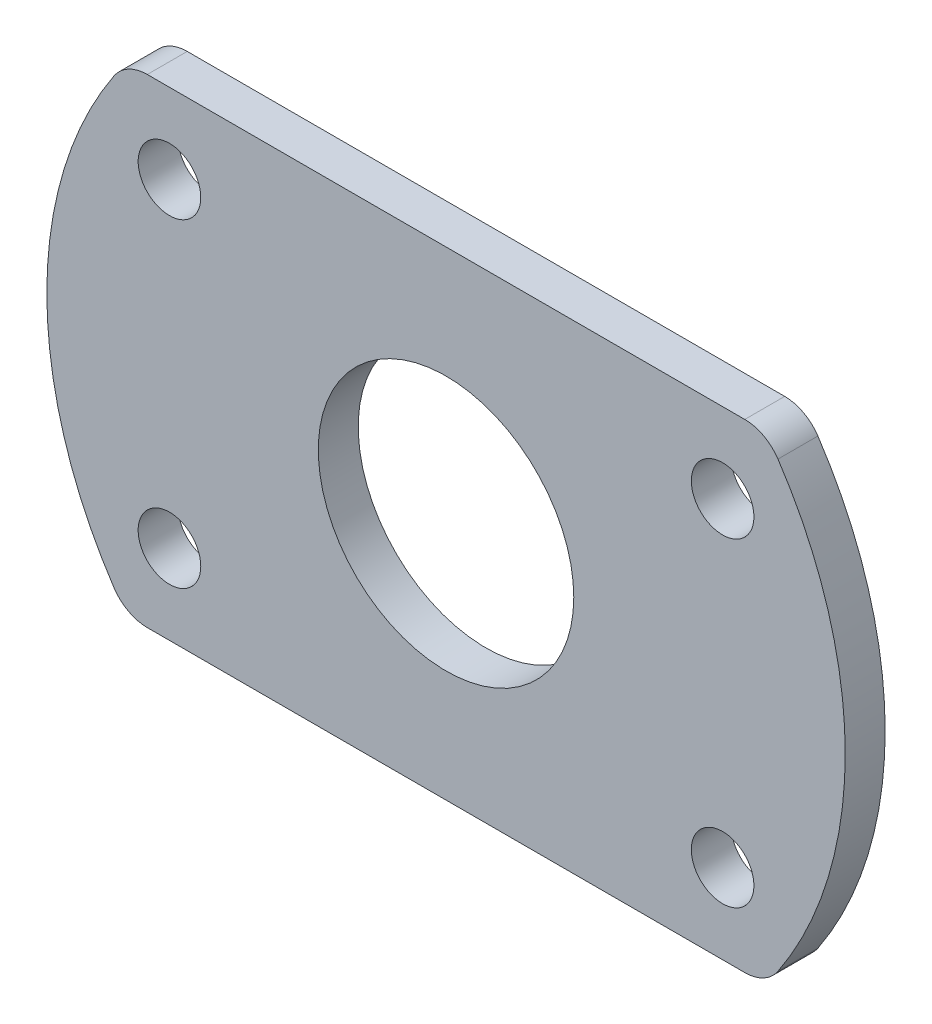
ISO-10303-21;
HEADER;
FILE_DESCRIPTION(('STEP AP214'),'2;1');
FILE_NAME('part.step','',(''),(''),'','','');
FILE_SCHEMA(('AUTOMOTIVE_DESIGN { 1 0 10303 214 1 1 1 1 }'));
ENDSEC;
DATA;
#1=APPLICATION_CONTEXT('core data for automotive mechanical design processes');
#2=APPLICATION_PROTOCOL_DEFINITION('international standard','automotive_design',2000,#1);
#3=PRODUCT_CONTEXT('',#1,'mechanical');
#4=PRODUCT('Part','Part','',(#3));
#5=PRODUCT_RELATED_PRODUCT_CATEGORY('part','',(#4));
#6=PRODUCT_DEFINITION_FORMATION('','',#4);
#7=PRODUCT_DEFINITION_CONTEXT('part definition',#1,'design');
#8=PRODUCT_DEFINITION('design','',#6,#7);
#9=PRODUCT_DEFINITION_SHAPE('','',#8);
#10=(LENGTH_UNIT() NAMED_UNIT(*) SI_UNIT(.MILLI.,.METRE.));
#11=(NAMED_UNIT(*) PLANE_ANGLE_UNIT() SI_UNIT($,.RADIAN.));
#12=(NAMED_UNIT(*) SI_UNIT($,.STERADIAN.) SOLID_ANGLE_UNIT());
#13=UNCERTAINTY_MEASURE_WITH_UNIT(LENGTH_MEASURE(1.E-05),#10,'distance_accuracy_value','');
#14=(GEOMETRIC_REPRESENTATION_CONTEXT(3) GLOBAL_UNCERTAINTY_ASSIGNED_CONTEXT((#13)) GLOBAL_UNIT_ASSIGNED_CONTEXT((#10,
#11,#12)) REPRESENTATION_CONTEXT('',''));
#15=CARTESIAN_POINT('',(0.,0.,0.));
#16=DIRECTION('',(0.,0.,1.));
#17=DIRECTION('',(1.,0.,0.));
#18=AXIS2_PLACEMENT_3D('',#15,#16,#17);
#19=CARTESIAN_POINT('',(0.,0.,1.5875));
#20=DIRECTION('',(0.,0.,1.));
#21=DIRECTION('',(1.,0.,0.));
#22=AXIS2_PLACEMENT_3D('',#19,#20,#21);
#23=PLANE('',#22);
#24=CARTESIAN_POINT('',(-21.9970452561248,12.7,1.5875));
#25=DIRECTION('',(0.,0.,1.));
#26=DIRECTION('',(1.,0.,0.));
#27=AXIS2_PLACEMENT_3D('',#24,#25,#26);
#28=CIRCLE('',#27,2.4892000000003);
#29=CARTESIAN_POINT('',(-19.5078452561245,12.7,1.5875));
#30=VERTEX_POINT('',#29);
#31=EDGE_CURVE('E200',#30,#30,#28,.T.);
#32=ORIENTED_EDGE('',*,*,#31,.F.);
#33=EDGE_LOOP('',(#32));
#34=FACE_BOUND('',#33,.T.);
#35=CARTESIAN_POINT('',(21.9970452561247,-12.7000000000001,1.5875));
#36=DIRECTION('',(0.,0.,1.));
#37=DIRECTION('',(1.,0.,0.));
#38=AXIS2_PLACEMENT_3D('',#35,#36,#37);
#39=CIRCLE('',#38,2.4892);
#40=CARTESIAN_POINT('',(24.4862452561247,-12.7000000000001,1.5875));
#41=VERTEX_POINT('',#40);
#42=EDGE_CURVE('E189',#41,#41,#39,.T.);
#43=ORIENTED_EDGE('',*,*,#42,.F.);
#44=EDGE_LOOP('',(#43));
#45=FACE_BOUND('',#44,.T.);
#46=DIRECTION('',(-1.,0.,0.));
#47=VECTOR('',#46,1.);
#48=CARTESIAN_POINT('',(0.,19.05,1.5875));
#49=LINE('',#48,#47);
#50=CARTESIAN_POINT('',(23.7595244060145,19.05,1.5875));
#51=VERTEX_POINT('',#50);
#52=CARTESIAN_POINT('',(-23.7595244060145,19.05,1.5875));
#53=VERTEX_POINT('',#52);
#54=EDGE_CURVE('E144',#51,#53,#49,.T.);
#55=ORIENTED_EDGE('',*,*,#54,.T.);
#56=CARTESIAN_POINT('',(-23.7595244060145,15.875,1.5875));
#57=DIRECTION('',(0.,0.,1.));
#58=DIRECTION('',(1.,0.,0.));
#59=AXIS2_PLACEMENT_3D('',#56,#57,#58);
#60=CIRCLE('',#59,3.175);
#61=CARTESIAN_POINT('',(-26.3994715622384,17.6388888888889,1.5875));
#62=VERTEX_POINT('',#61);
#63=EDGE_CURVE('E163',#53,#62,#60,.T.);
#64=ORIENTED_EDGE('',*,*,#63,.T.);
#65=CARTESIAN_POINT('',(0.,0.,1.5875));
#66=DIRECTION('',(0.,0.,1.));
#67=DIRECTION('',(1.,0.,0.));
#68=AXIS2_PLACEMENT_3D('',#65,#66,#67);
#69=CIRCLE('',#68,31.75);
#70=CARTESIAN_POINT('',(-26.3994715622384,-17.6388888888889,1.5875));
#71=VERTEX_POINT('',#70);
#72=EDGE_CURVE('E127',#62,#71,#69,.T.);
#73=ORIENTED_EDGE('',*,*,#72,.T.);
#74=CARTESIAN_POINT('',(-23.7595244060145,-15.875,1.5875));
#75=DIRECTION('',(0.,0.,1.));
#76=DIRECTION('',(1.,0.,0.));
#77=AXIS2_PLACEMENT_3D('',#74,#75,#76);
#78=CIRCLE('',#77,3.175);
#79=CARTESIAN_POINT('',(-23.7595244060145,-19.05,1.5875));
#80=VERTEX_POINT('',#79);
#81=EDGE_CURVE('E158',#71,#80,#78,.T.);
#82=ORIENTED_EDGE('',*,*,#81,.T.);
#83=DIRECTION('',(1.,0.,0.));
#84=VECTOR('',#83,1.);
#85=CARTESIAN_POINT('',(-25.4,-19.05,1.5875));
#86=LINE('',#85,#84);
#87=CARTESIAN_POINT('',(23.7595244060145,-19.05,1.5875));
#88=VERTEX_POINT('',#87);
#89=EDGE_CURVE('E174',#80,#88,#86,.T.);
#90=ORIENTED_EDGE('',*,*,#89,.T.);
#91=CARTESIAN_POINT('',(23.7595244060145,-15.875,1.5875));
#92=DIRECTION('',(0.,0.,1.));
#93=DIRECTION('',(1.,0.,0.));
#94=AXIS2_PLACEMENT_3D('',#91,#92,#93);
#95=CIRCLE('',#94,3.175);
#96=CARTESIAN_POINT('',(26.3994715622384,-17.6388888888889,1.5875));
#97=VERTEX_POINT('',#96);
#98=EDGE_CURVE('E63',#88,#97,#95,.T.);
#99=ORIENTED_EDGE('',*,*,#98,.T.);
#100=CARTESIAN_POINT('',(0.,0.,1.5875));
#101=DIRECTION('',(0.,0.,1.));
#102=DIRECTION('',(1.,0.,0.));
#103=AXIS2_PLACEMENT_3D('',#100,#101,#102);
#104=CIRCLE('',#103,31.75);
#105=CARTESIAN_POINT('',(26.3994715622384,17.6388888888889,1.5875));
#106=VERTEX_POINT('',#105);
#107=EDGE_CURVE('E182',#97,#106,#104,.T.);
#108=ORIENTED_EDGE('',*,*,#107,.T.);
#109=CARTESIAN_POINT('',(23.7595244060145,15.875,1.5875));
#110=DIRECTION('',(0.,0.,1.));
#111=DIRECTION('',(1.,0.,0.));
#112=AXIS2_PLACEMENT_3D('',#109,#110,#111);
#113=CIRCLE('',#112,3.175);
#114=EDGE_CURVE('E161',#106,#51,#113,.T.);
#115=ORIENTED_EDGE('',*,*,#114,.T.);
#116=EDGE_LOOP('',(#55,#64,#73,#82,#90,#99,#108,#115));
#117=FACE_BOUND('',#116,.T.);
#118=CARTESIAN_POINT('',(21.9970452561248,12.6999999999999,1.5875));
#119=DIRECTION('',(0.,0.,1.));
#120=DIRECTION('',(1.,0.,0.));
#121=AXIS2_PLACEMENT_3D('',#118,#119,#120);
#122=CIRCLE('',#121,2.4892);
#123=CARTESIAN_POINT('',(24.4862452561248,12.6999999999999,1.5875));
#124=VERTEX_POINT('',#123);
#125=EDGE_CURVE('E135',#124,#124,#122,.T.);
#126=ORIENTED_EDGE('',*,*,#125,.F.);
#127=EDGE_LOOP('',(#126));
#128=FACE_BOUND('',#127,.T.);
#129=CARTESIAN_POINT('',(-21.9970452561249,-12.6999999999998,1.5875));
#130=DIRECTION('',(0.,0.,1.));
#131=DIRECTION('',(1.,0.,0.));
#132=AXIS2_PLACEMENT_3D('',#129,#130,#131);
#133=CIRCLE('',#132,2.4892);
#134=CARTESIAN_POINT('',(-19.5078452561249,-12.6999999999998,1.5875));
#135=VERTEX_POINT('',#134);
#136=EDGE_CURVE('E194',#135,#135,#133,.T.);
#137=ORIENTED_EDGE('',*,*,#136,.F.);
#138=EDGE_LOOP('',(#137));
#139=FACE_BOUND('',#138,.T.);
#140=CARTESIAN_POINT('',(0.,0.,1.5875));
#141=DIRECTION('',(0.,0.,1.));
#142=DIRECTION('',(1.,0.,0.));
#143=AXIS2_PLACEMENT_3D('',#140,#141,#142);
#144=CIRCLE('',#143,10.16);
#145=CARTESIAN_POINT('',(10.16,0.,1.5875));
#146=VERTEX_POINT('',#145);
#147=EDGE_CURVE('E206',#146,#146,#144,.T.);
#148=ORIENTED_EDGE('',*,*,#147,.F.);
#149=EDGE_LOOP('',(#148));
#150=FACE_BOUND('',#149,.T.);
#151=ADVANCED_FACE('F41',(#34,#45,#117,#128,#139,#150),#23,.T.);
#152=CARTESIAN_POINT('',(0.,0.,-1.5875));
#153=DIRECTION('',(0.,0.,1.));
#154=DIRECTION('',(1.,0.,0.));
#155=AXIS2_PLACEMENT_3D('',#152,#153,#154);
#156=PLANE('',#155);
#157=CARTESIAN_POINT('',(0.,0.,-1.5875));
#158=DIRECTION('',(0.,0.,1.));
#159=DIRECTION('',(1.,0.,0.));
#160=AXIS2_PLACEMENT_3D('',#157,#158,#159);
#161=CIRCLE('',#160,31.75);
#162=CARTESIAN_POINT('',(-26.3994715622384,17.6388888888889,-1.5875));
#163=VERTEX_POINT('',#162);
#164=CARTESIAN_POINT('',(-26.3994715622384,-17.6388888888889,-1.5875));
#165=VERTEX_POINT('',#164);
#166=EDGE_CURVE('E124',#163,#165,#161,.T.);
#167=ORIENTED_EDGE('',*,*,#166,.F.);
#168=CARTESIAN_POINT('',(-23.7595244060145,15.875,-1.5875));
#169=DIRECTION('',(0.,0.,1.));
#170=DIRECTION('',(1.,0.,0.));
#171=AXIS2_PLACEMENT_3D('',#168,#169,#170);
#172=CIRCLE('',#171,3.175);
#173=CARTESIAN_POINT('',(-23.7595244060145,19.05,-1.5875));
#174=VERTEX_POINT('',#173);
#175=EDGE_CURVE('E107',#163,#174,#172,.F.);
#176=ORIENTED_EDGE('',*,*,#175,.T.);
#177=DIRECTION('',(-1.,0.,0.));
#178=VECTOR('',#177,1.);
#179=CARTESIAN_POINT('',(-25.4,19.05,-1.5875));
#180=LINE('',#179,#178);
#181=CARTESIAN_POINT('',(23.7595244060145,19.05,-1.5875));
#182=VERTEX_POINT('',#181);
#183=EDGE_CURVE('E148',#182,#174,#180,.T.);
#184=ORIENTED_EDGE('',*,*,#183,.F.);
#185=CARTESIAN_POINT('',(23.7595244060145,15.875,-1.5875));
#186=DIRECTION('',(0.,0.,1.));
#187=DIRECTION('',(1.,0.,0.));
#188=AXIS2_PLACEMENT_3D('',#185,#186,#187);
#189=CIRCLE('',#188,3.175);
#190=CARTESIAN_POINT('',(26.3994715622384,17.6388888888889,-1.5875));
#191=VERTEX_POINT('',#190);
#192=EDGE_CURVE('E118',#182,#191,#189,.F.);
#193=ORIENTED_EDGE('',*,*,#192,.T.);
#194=CARTESIAN_POINT('',(0.,0.,-1.5875));
#195=DIRECTION('',(0.,0.,1.));
#196=DIRECTION('',(1.,0.,0.));
#197=AXIS2_PLACEMENT_3D('',#194,#195,#196);
#198=CIRCLE('',#197,31.75);
#199=CARTESIAN_POINT('',(26.3994715622384,-17.6388888888889,-1.5875));
#200=VERTEX_POINT('',#199);
#201=EDGE_CURVE('E138',#200,#191,#198,.T.);
#202=ORIENTED_EDGE('',*,*,#201,.F.);
#203=CARTESIAN_POINT('',(23.7595244060145,-15.875,-1.5875));
#204=DIRECTION('',(0.,0.,1.));
#205=DIRECTION('',(1.,0.,0.));
#206=AXIS2_PLACEMENT_3D('',#203,#204,#205);
#207=CIRCLE('',#206,3.175);
#208=CARTESIAN_POINT('',(23.7595244060145,-19.05,-1.5875));
#209=VERTEX_POINT('',#208);
#210=EDGE_CURVE('E152',#200,#209,#207,.F.);
#211=ORIENTED_EDGE('',*,*,#210,.T.);
#212=DIRECTION('',(1.,0.,0.));
#213=VECTOR('',#212,1.);
#214=CARTESIAN_POINT('',(0.,-19.05,-1.5875));
#215=LINE('',#214,#213);
#216=CARTESIAN_POINT('',(-23.7595244060145,-19.05,-1.5875));
#217=VERTEX_POINT('',#216);
#218=EDGE_CURVE('E134',#217,#209,#215,.T.);
#219=ORIENTED_EDGE('',*,*,#218,.F.);
#220=CARTESIAN_POINT('',(-23.7595244060145,-15.875,-1.5875));
#221=DIRECTION('',(0.,0.,1.));
#222=DIRECTION('',(1.,0.,0.));
#223=AXIS2_PLACEMENT_3D('',#220,#221,#222);
#224=CIRCLE('',#223,3.175);
#225=EDGE_CURVE('E128',#217,#165,#224,.F.);
#226=ORIENTED_EDGE('',*,*,#225,.T.);
#227=EDGE_LOOP('',(#167,#176,#184,#193,#202,#211,#219,#226));
#228=FACE_BOUND('',#227,.T.);
#229=CARTESIAN_POINT('',(21.9970452561248,12.6999999999999,-1.5875));
#230=DIRECTION('',(0.,0.,1.));
#231=DIRECTION('',(1.,0.,0.));
#232=AXIS2_PLACEMENT_3D('',#229,#230,#231);
#233=CIRCLE('',#232,2.4892);
#234=CARTESIAN_POINT('',(24.4862452561248,12.6999999999999,-1.5875));
#235=VERTEX_POINT('',#234);
#236=EDGE_CURVE('E141',#235,#235,#233,.T.);
#237=ORIENTED_EDGE('',*,*,#236,.T.);
#238=EDGE_LOOP('',(#237));
#239=FACE_BOUND('',#238,.T.);
#240=CARTESIAN_POINT('',(21.9970452561247,-12.7000000000001,-1.5875));
#241=DIRECTION('',(0.,0.,1.));
#242=DIRECTION('',(1.,0.,0.));
#243=AXIS2_PLACEMENT_3D('',#240,#241,#242);
#244=CIRCLE('',#243,2.4892);
#245=CARTESIAN_POINT('',(24.4862452561247,-12.7000000000001,-1.5875));
#246=VERTEX_POINT('',#245);
#247=EDGE_CURVE('E191',#246,#246,#244,.T.);
#248=ORIENTED_EDGE('',*,*,#247,.T.);
#249=EDGE_LOOP('',(#248));
#250=FACE_BOUND('',#249,.T.);
#251=CARTESIAN_POINT('',(-21.9970452561249,-12.6999999999998,-1.5875));
#252=DIRECTION('',(0.,0.,1.));
#253=DIRECTION('',(1.,0.,0.));
#254=AXIS2_PLACEMENT_3D('',#251,#252,#253);
#255=CIRCLE('',#254,2.4892);
#256=CARTESIAN_POINT('',(-19.5078452561249,-12.6999999999998,-1.5875));
#257=VERTEX_POINT('',#256);
#258=EDGE_CURVE('E197',#257,#257,#255,.T.);
#259=ORIENTED_EDGE('',*,*,#258,.T.);
#260=EDGE_LOOP('',(#259));
#261=FACE_BOUND('',#260,.T.);
#262=CARTESIAN_POINT('',(-21.9970452561248,12.7,-1.5875));
#263=DIRECTION('',(0.,0.,1.));
#264=DIRECTION('',(1.,0.,0.));
#265=AXIS2_PLACEMENT_3D('',#262,#263,#264);
#266=CIRCLE('',#265,2.4892000000003);
#267=CARTESIAN_POINT('',(-19.5078452561245,12.7,-1.5875));
#268=VERTEX_POINT('',#267);
#269=EDGE_CURVE('E203',#268,#268,#266,.T.);
#270=ORIENTED_EDGE('',*,*,#269,.T.);
#271=EDGE_LOOP('',(#270));
#272=FACE_BOUND('',#271,.T.);
#273=CARTESIAN_POINT('',(0.,0.,-1.5875));
#274=DIRECTION('',(0.,0.,1.));
#275=DIRECTION('',(1.,0.,0.));
#276=AXIS2_PLACEMENT_3D('',#273,#274,#275);
#277=CIRCLE('',#276,10.16);
#278=CARTESIAN_POINT('',(10.16,0.,-1.5875));
#279=VERTEX_POINT('',#278);
#280=EDGE_CURVE('E209',#279,#279,#277,.T.);
#281=ORIENTED_EDGE('',*,*,#280,.T.);
#282=EDGE_LOOP('',(#281));
#283=FACE_BOUND('',#282,.T.);
#284=ADVANCED_FACE('F131',(#228,#239,#250,#261,#272,#283),#156,.F.);
#285=CARTESIAN_POINT('',(0.,0.,1.5875));
#286=DIRECTION('',(0.,0.,-1.));
#287=DIRECTION('',(-1.,0.,0.));
#288=AXIS2_PLACEMENT_3D('',#285,#286,#287);
#289=CYLINDRICAL_SURFACE('',#288,31.75);
#290=ORIENTED_EDGE('',*,*,#72,.F.);
#291=DIRECTION('',(0.,0.,-1.));
#292=VECTOR('',#291,1.);
#293=CARTESIAN_POINT('',(-26.3994715622384,17.6388888888889,1.5875));
#294=LINE('',#293,#292);
#295=EDGE_CURVE('E111',#62,#163,#294,.T.);
#296=ORIENTED_EDGE('',*,*,#295,.T.);
#297=ORIENTED_EDGE('',*,*,#166,.T.);
#298=DIRECTION('',(0.,0.,-1.));
#299=VECTOR('',#298,1.);
#300=CARTESIAN_POINT('',(-26.3994715622384,-17.6388888888889,1.5875));
#301=LINE('',#300,#299);
#302=EDGE_CURVE('E129',#165,#71,#301,.F.);
#303=ORIENTED_EDGE('',*,*,#302,.T.);
#304=EDGE_LOOP('',(#290,#296,#297,#303));
#305=FACE_BOUND('',#304,.T.);
#306=ADVANCED_FACE('F123',(#305),#289,.T.);
#307=CARTESIAN_POINT('',(0.,-19.05,1.5875));
#308=DIRECTION('',(0.,1.,0.));
#309=DIRECTION('',(0.,0.,1.));
#310=AXIS2_PLACEMENT_3D('',#307,#308,#309);
#311=PLANE('',#310);
#312=ORIENTED_EDGE('',*,*,#218,.T.);
#313=DIRECTION('',(0.,0.,-1.));
#314=VECTOR('',#313,1.);
#315=CARTESIAN_POINT('',(23.7595244060145,-19.05,1.5875));
#316=LINE('',#315,#314);
#317=EDGE_CURVE('E11',#209,#88,#316,.F.);
#318=ORIENTED_EDGE('',*,*,#317,.T.);
#319=ORIENTED_EDGE('',*,*,#89,.F.);
#320=DIRECTION('',(0.,0.,-1.));
#321=VECTOR('',#320,1.);
#322=CARTESIAN_POINT('',(-23.7595244060145,-19.05,1.5875));
#323=LINE('',#322,#321);
#324=EDGE_CURVE('E49',#80,#217,#323,.T.);
#325=ORIENTED_EDGE('',*,*,#324,.T.);
#326=EDGE_LOOP('',(#312,#318,#319,#325));
#327=FACE_BOUND('',#326,.T.);
#328=ADVANCED_FACE('F172',(#327),#311,.F.);
#329=CARTESIAN_POINT('',(0.,0.,1.5875));
#330=DIRECTION('',(0.,0.,-1.));
#331=DIRECTION('',(-1.,0.,0.));
#332=AXIS2_PLACEMENT_3D('',#329,#330,#331);
#333=CYLINDRICAL_SURFACE('',#332,31.75);
#334=ORIENTED_EDGE('',*,*,#201,.T.);
#335=DIRECTION('',(0.,0.,-1.));
#336=VECTOR('',#335,1.);
#337=CARTESIAN_POINT('',(26.3994715622384,17.6388888888889,1.5875));
#338=LINE('',#337,#336);
#339=EDGE_CURVE('E56',#191,#106,#338,.F.);
#340=ORIENTED_EDGE('',*,*,#339,.T.);
#341=ORIENTED_EDGE('',*,*,#107,.F.);
#342=DIRECTION('',(0.,0.,-1.));
#343=VECTOR('',#342,1.);
#344=CARTESIAN_POINT('',(26.3994715622384,-17.6388888888889,1.5875));
#345=LINE('',#344,#343);
#346=EDGE_CURVE('E165',#97,#200,#345,.T.);
#347=ORIENTED_EDGE('',*,*,#346,.T.);
#348=EDGE_LOOP('',(#334,#340,#341,#347));
#349=FACE_BOUND('',#348,.T.);
#350=ADVANCED_FACE('F181',(#349),#333,.T.);
#351=CARTESIAN_POINT('',(-25.4,19.05,1.5875));
#352=DIRECTION('',(0.,-1.,0.));
#353=DIRECTION('',(0.,0.,-1.));
#354=AXIS2_PLACEMENT_3D('',#351,#352,#353);
#355=PLANE('',#354);
#356=ORIENTED_EDGE('',*,*,#183,.T.);
#357=DIRECTION('',(0.,0.,-1.));
#358=VECTOR('',#357,1.);
#359=CARTESIAN_POINT('',(-23.7595244060145,19.05,1.5875));
#360=LINE('',#359,#358);
#361=EDGE_CURVE('E112',#174,#53,#360,.F.);
#362=ORIENTED_EDGE('',*,*,#361,.T.);
#363=ORIENTED_EDGE('',*,*,#54,.F.);
#364=DIRECTION('',(0.,0.,-1.));
#365=VECTOR('',#364,1.);
#366=CARTESIAN_POINT('',(23.7595244060145,19.05,1.5875));
#367=LINE('',#366,#365);
#368=EDGE_CURVE('E117',#51,#182,#367,.T.);
#369=ORIENTED_EDGE('',*,*,#368,.T.);
#370=EDGE_LOOP('',(#356,#362,#363,#369));
#371=FACE_BOUND('',#370,.T.);
#372=ADVANCED_FACE('F232',(#371),#355,.F.);
#373=CARTESIAN_POINT('',(21.9970452561248,12.6999999999999,1.5875));
#374=DIRECTION('',(0.,0.,-1.));
#375=DIRECTION('',(-1.,0.,0.));
#376=AXIS2_PLACEMENT_3D('',#373,#374,#375);
#377=CYLINDRICAL_SURFACE('',#376,2.4892);
#378=ORIENTED_EDGE('',*,*,#125,.T.);
#379=EDGE_LOOP('',(#378));
#380=FACE_BOUND('',#379,.T.);
#381=ORIENTED_EDGE('',*,*,#236,.F.);
#382=EDGE_LOOP('',(#381));
#383=FACE_BOUND('',#382,.T.);
#384=ADVANCED_FACE('F229',(#380,#383),#377,.F.);
#385=CARTESIAN_POINT('',(21.9970452561247,-12.7000000000001,1.5875));
#386=DIRECTION('',(0.,0.,-1.));
#387=DIRECTION('',(-1.,0.,0.));
#388=AXIS2_PLACEMENT_3D('',#385,#386,#387);
#389=CYLINDRICAL_SURFACE('',#388,2.4892);
#390=ORIENTED_EDGE('',*,*,#42,.T.);
#391=EDGE_LOOP('',(#390));
#392=FACE_BOUND('',#391,.T.);
#393=ORIENTED_EDGE('',*,*,#247,.F.);
#394=EDGE_LOOP('',(#393));
#395=FACE_BOUND('',#394,.T.);
#396=ADVANCED_FACE('F264',(#392,#395),#389,.F.);
#397=CARTESIAN_POINT('',(-21.9970452561249,-12.6999999999998,1.5875));
#398=DIRECTION('',(0.,0.,-1.));
#399=DIRECTION('',(-1.,0.,0.));
#400=AXIS2_PLACEMENT_3D('',#397,#398,#399);
#401=CYLINDRICAL_SURFACE('',#400,2.4892);
#402=ORIENTED_EDGE('',*,*,#136,.T.);
#403=EDGE_LOOP('',(#402));
#404=FACE_BOUND('',#403,.T.);
#405=ORIENTED_EDGE('',*,*,#258,.F.);
#406=EDGE_LOOP('',(#405));
#407=FACE_BOUND('',#406,.T.);
#408=ADVANCED_FACE('F260',(#404,#407),#401,.F.);
#409=CARTESIAN_POINT('',(-21.9970452561248,12.7,1.5875));
#410=DIRECTION('',(0.,0.,-1.));
#411=DIRECTION('',(-1.,0.,0.));
#412=AXIS2_PLACEMENT_3D('',#409,#410,#411);
#413=CYLINDRICAL_SURFACE('',#412,2.4892000000003);
#414=ORIENTED_EDGE('',*,*,#31,.T.);
#415=EDGE_LOOP('',(#414));
#416=FACE_BOUND('',#415,.T.);
#417=ORIENTED_EDGE('',*,*,#269,.F.);
#418=EDGE_LOOP('',(#417));
#419=FACE_BOUND('',#418,.T.);
#420=ADVANCED_FACE('F263',(#416,#419),#413,.F.);
#421=CARTESIAN_POINT('',(0.,0.,1.5875));
#422=DIRECTION('',(0.,0.,-1.));
#423=DIRECTION('',(-1.,0.,0.));
#424=AXIS2_PLACEMENT_3D('',#421,#422,#423);
#425=CYLINDRICAL_SURFACE('',#424,10.16);
#426=ORIENTED_EDGE('',*,*,#147,.T.);
#427=EDGE_LOOP('',(#426));
#428=FACE_BOUND('',#427,.T.);
#429=ORIENTED_EDGE('',*,*,#280,.F.);
#430=EDGE_LOOP('',(#429));
#431=FACE_BOUND('',#430,.T.);
#432=ADVANCED_FACE('F215',(#428,#431),#425,.F.);
#433=CARTESIAN_POINT('',(-23.7595244060145,15.875,1.5875));
#434=DIRECTION('',(0.,0.,-1.));
#435=DIRECTION('',(-1.,0.,0.));
#436=AXIS2_PLACEMENT_3D('',#433,#434,#435);
#437=CYLINDRICAL_SURFACE('',#436,3.175);
#438=ORIENTED_EDGE('',*,*,#63,.F.);
#439=ORIENTED_EDGE('',*,*,#361,.F.);
#440=ORIENTED_EDGE('',*,*,#175,.F.);
#441=ORIENTED_EDGE('',*,*,#295,.F.);
#442=EDGE_LOOP('',(#438,#439,#440,#441));
#443=FACE_BOUND('',#442,.T.);
#444=ADVANCED_FACE('F110',(#443),#437,.T.);
#445=CARTESIAN_POINT('',(23.7595244060145,15.875,1.5875));
#446=DIRECTION('',(0.,0.,-1.));
#447=DIRECTION('',(-1.,0.,0.));
#448=AXIS2_PLACEMENT_3D('',#445,#446,#447);
#449=CYLINDRICAL_SURFACE('',#448,3.175);
#450=ORIENTED_EDGE('',*,*,#114,.F.);
#451=ORIENTED_EDGE('',*,*,#339,.F.);
#452=ORIENTED_EDGE('',*,*,#192,.F.);
#453=ORIENTED_EDGE('',*,*,#368,.F.);
#454=EDGE_LOOP('',(#450,#451,#452,#453));
#455=FACE_BOUND('',#454,.T.);
#456=ADVANCED_FACE('F244',(#455),#449,.T.);
#457=CARTESIAN_POINT('',(23.7595244060145,-15.875,1.5875));
#458=DIRECTION('',(0.,0.,-1.));
#459=DIRECTION('',(-1.,0.,0.));
#460=AXIS2_PLACEMENT_3D('',#457,#458,#459);
#461=CYLINDRICAL_SURFACE('',#460,3.175);
#462=ORIENTED_EDGE('',*,*,#98,.F.);
#463=ORIENTED_EDGE('',*,*,#317,.F.);
#464=ORIENTED_EDGE('',*,*,#210,.F.);
#465=ORIENTED_EDGE('',*,*,#346,.F.);
#466=EDGE_LOOP('',(#462,#463,#464,#465));
#467=FACE_BOUND('',#466,.T.);
#468=ADVANCED_FACE('F180',(#467),#461,.T.);
#469=CARTESIAN_POINT('',(-23.7595244060145,-15.875,1.5875));
#470=DIRECTION('',(0.,0.,-1.));
#471=DIRECTION('',(-1.,0.,0.));
#472=AXIS2_PLACEMENT_3D('',#469,#470,#471);
#473=CYLINDRICAL_SURFACE('',#472,3.175);
#474=ORIENTED_EDGE('',*,*,#81,.F.);
#475=ORIENTED_EDGE('',*,*,#302,.F.);
#476=ORIENTED_EDGE('',*,*,#225,.F.);
#477=ORIENTED_EDGE('',*,*,#324,.F.);
#478=EDGE_LOOP('',(#474,#475,#476,#477));
#479=FACE_BOUND('',#478,.T.);
#480=ADVANCED_FACE('F43',(#479),#473,.T.);
#481=CLOSED_SHELL('',(#151,#284,#306,#328,#350,#372,#384,#396,#408,#420,#432,#444,#456,#468,#480));
#482=MANIFOLD_SOLID_BREP('B2',#481);
#483=ADVANCED_BREP_SHAPE_REPRESENTATION('',(#18,#482),#14);
#484=SHAPE_DEFINITION_REPRESENTATION(#9,#483);
ENDSEC;
END-ISO-10303-21;
